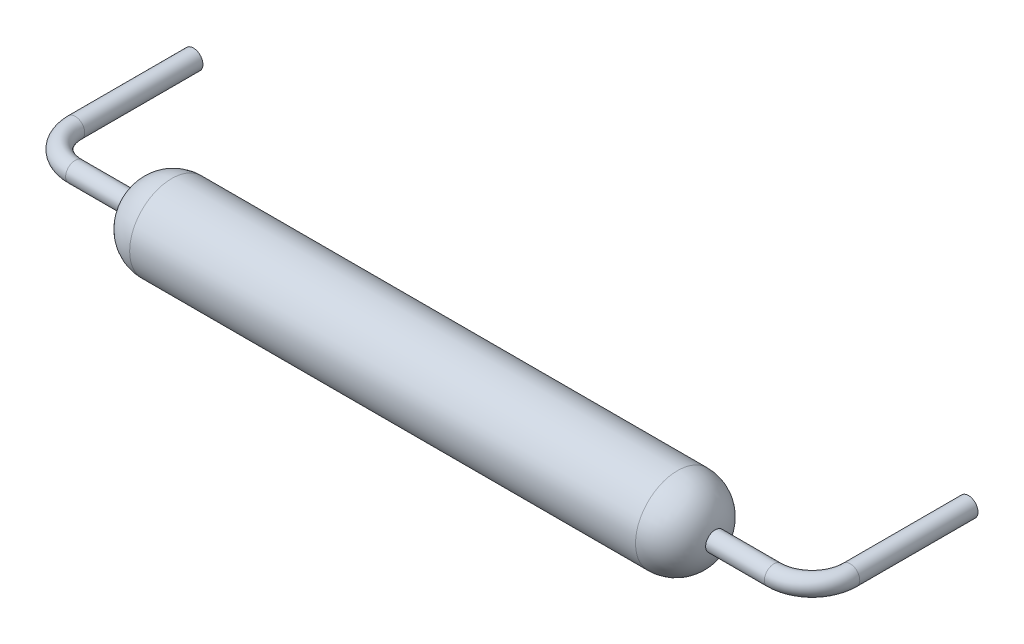
ISO-10303-21;
HEADER;
FILE_DESCRIPTION(('STEP AP214'),'2;1');
FILE_NAME('part.step','',(''),(''),'','','');
FILE_SCHEMA(('AUTOMOTIVE_DESIGN { 1 0 10303 214 1 1 1 1 }'));
ENDSEC;
DATA;
#1=APPLICATION_CONTEXT('core data for automotive mechanical design processes');
#2=APPLICATION_PROTOCOL_DEFINITION('international standard','automotive_design',2000,#1);
#3=PRODUCT_CONTEXT('',#1,'mechanical');
#4=PRODUCT('Part','Part','',(#3));
#5=PRODUCT_RELATED_PRODUCT_CATEGORY('part','',(#4));
#6=PRODUCT_DEFINITION_FORMATION('','',#4);
#7=PRODUCT_DEFINITION_CONTEXT('part definition',#1,'design');
#8=PRODUCT_DEFINITION('design','',#6,#7);
#9=PRODUCT_DEFINITION_SHAPE('','',#8);
#10=(LENGTH_UNIT() NAMED_UNIT(*) SI_UNIT(.MILLI.,.METRE.));
#11=(NAMED_UNIT(*) PLANE_ANGLE_UNIT() SI_UNIT($,.RADIAN.));
#12=(NAMED_UNIT(*) SI_UNIT($,.STERADIAN.) SOLID_ANGLE_UNIT());
#13=UNCERTAINTY_MEASURE_WITH_UNIT(LENGTH_MEASURE(1.E-05),#10,'distance_accuracy_value','');
#14=(GEOMETRIC_REPRESENTATION_CONTEXT(3) GLOBAL_UNCERTAINTY_ASSIGNED_CONTEXT((#13)) GLOBAL_UNIT_ASSIGNED_CONTEXT((#10,
#11,#12)) REPRESENTATION_CONTEXT('',''));
#15=CARTESIAN_POINT('',(0.,0.,0.));
#16=DIRECTION('',(0.,0.,1.));
#17=DIRECTION('',(1.,0.,0.));
#18=AXIS2_PLACEMENT_3D('',#15,#16,#17);
#19=CARTESIAN_POINT('',(10.16,0.,1.1));
#20=DIRECTION('',(-1.,0.,0.));
#21=DIRECTION('',(0.,0.,1.));
#22=AXIS2_PLACEMENT_3D('',#19,#20,#21);
#23=CYLINDRICAL_SURFACE('',#22,1.1);
#24=CARTESIAN_POINT('',(3.52868599666425,0.,1.1));
#25=DIRECTION('',(-1.,0.,0.));
#26=DIRECTION('',(0.,0.,1.));
#27=AXIS2_PLACEMENT_3D('',#24,#25,#26);
#28=CIRCLE('',#27,1.1);
#29=CARTESIAN_POINT('',(3.52868599666425,0.,2.2));
#30=VERTEX_POINT('',#29);
#31=EDGE_CURVE('E10',#30,#30,#28,.F.);
#32=ORIENTED_EDGE('',*,*,#31,.T.);
#33=EDGE_LOOP('',(#32));
#34=FACE_BOUND('',#33,.T.);
#35=CARTESIAN_POINT('',(16.7913140033357,0.,1.1));
#36=DIRECTION('',(-1.,0.,0.));
#37=DIRECTION('',(0.,0.,1.));
#38=AXIS2_PLACEMENT_3D('',#35,#36,#37);
#39=CIRCLE('',#38,1.1);
#40=CARTESIAN_POINT('',(16.7913140033357,0.,2.2));
#41=VERTEX_POINT('',#40);
#42=EDGE_CURVE('E58',#41,#41,#39,.F.);
#43=ORIENTED_EDGE('',*,*,#42,.F.);
#44=EDGE_LOOP('',(#43));
#45=FACE_BOUND('',#44,.T.);
#46=ADVANCED_FACE('F33',(#34,#45),#23,.T.);
#47=CARTESIAN_POINT('',(0.,0.,0.100000000000001));
#48=DIRECTION('',(0.,0.,-1.));
#49=DIRECTION('',(-1.,0.,0.));
#50=AXIS2_PLACEMENT_3D('',#47,#48,#49);
#51=CYLINDRICAL_SURFACE('',#50,0.25);
#52=CARTESIAN_POINT('',(0.,0.,0.100000000000001));
#53=DIRECTION('',(0.,0.,-1.));
#54=DIRECTION('',(-1.,0.,0.));
#55=AXIS2_PLACEMENT_3D('',#52,#53,#54);
#56=CIRCLE('',#55,0.25);
#57=CARTESIAN_POINT('',(-0.250000000000001,0.,0.100000000000001));
#58=VERTEX_POINT('',#57);
#59=EDGE_CURVE('E49',#58,#58,#56,.T.);
#60=ORIENTED_EDGE('',*,*,#59,.T.);
#61=EDGE_LOOP('',(#60));
#62=FACE_BOUND('',#61,.T.);
#63=CARTESIAN_POINT('',(0.,0.,-3.));
#64=DIRECTION('',(0.,0.,-1.));
#65=DIRECTION('',(-1.,0.,0.));
#66=AXIS2_PLACEMENT_3D('',#63,#64,#65);
#67=CIRCLE('',#66,0.25);
#68=CARTESIAN_POINT('',(-0.250000000000001,0.,-3.));
#69=VERTEX_POINT('',#68);
#70=EDGE_CURVE('E44',#69,#69,#67,.T.);
#71=ORIENTED_EDGE('',*,*,#70,.F.);
#72=EDGE_LOOP('',(#71));
#73=FACE_BOUND('',#72,.T.);
#74=ADVANCED_FACE('F105',(#62,#73),#51,.T.);
#75=CARTESIAN_POINT('',(1.,0.,0.1));
#76=DIRECTION('',(0.,-1.,0.));
#77=DIRECTION('',(0.,0.,-1.));
#78=AXIS2_PLACEMENT_3D('',#75,#76,#77);
#79=TOROIDAL_SURFACE('',#78,1.,0.25);
#80=CARTESIAN_POINT('',(1.,0.,1.1));
#81=DIRECTION('',(-1.,0.,0.));
#82=DIRECTION('',(0.,0.,1.));
#83=AXIS2_PLACEMENT_3D('',#80,#81,#82);
#84=CIRCLE('',#83,0.25);
#85=CARTESIAN_POINT('',(1.,0.,1.35));
#86=VERTEX_POINT('',#85);
#87=EDGE_CURVE('E52',#86,#86,#84,.T.);
#88=CARTESIAN_POINT('',(1.,0.,0.1));
#89=DIRECTION('',(0.,-1.,0.));
#90=DIRECTION('',(0.,0.,-1.));
#91=AXIS2_PLACEMENT_3D('',#88,#89,#90);
#92=CIRCLE('',#91,1.25);
#93=EDGE_CURVE('',#86,#58,#92,.T.);
#94=ORIENTED_EDGE('',*,*,#87,.T.);
#95=ORIENTED_EDGE('',*,*,#59,.F.);
#96=ORIENTED_EDGE('',*,*,#93,.T.);
#97=ORIENTED_EDGE('',*,*,#93,.F.);
#98=EDGE_LOOP('',(#94,#96,#95,#97));
#99=FACE_BOUND('',#98,.T.);
#100=ADVANCED_FACE('F109',(#99),#79,.T.);
#101=CARTESIAN_POINT('',(1.,0.,1.1));
#102=DIRECTION('',(1.,0.,0.));
#103=DIRECTION('',(0.,0.,-1.));
#104=AXIS2_PLACEMENT_3D('',#101,#102,#103);
#105=CYLINDRICAL_SURFACE('',#104,0.25);
#106=ORIENTED_EDGE('',*,*,#87,.F.);
#107=EDGE_LOOP('',(#106));
#108=FACE_BOUND('',#107,.T.);
#109=CARTESIAN_POINT('',(2.54,0.,1.1));
#110=DIRECTION('',(-1.,0.,0.));
#111=DIRECTION('',(0.,0.,1.));
#112=AXIS2_PLACEMENT_3D('',#109,#110,#111);
#113=CIRCLE('',#112,0.25);
#114=CARTESIAN_POINT('',(2.54,0.,1.35));
#115=VERTEX_POINT('',#114);
#116=EDGE_CURVE('E40',#115,#115,#113,.T.);
#117=ORIENTED_EDGE('',*,*,#116,.T.);
#118=EDGE_LOOP('',(#117));
#119=FACE_BOUND('',#118,.T.);
#120=ADVANCED_FACE('F115',(#108,#119),#105,.T.);
#121=CARTESIAN_POINT('',(0.,0.,-3.));
#122=DIRECTION('',(0.,0.,-1.));
#123=DIRECTION('',(-1.,0.,0.));
#124=AXIS2_PLACEMENT_3D('',#121,#122,#123);
#125=PLANE('',#124);
#126=ORIENTED_EDGE('',*,*,#70,.T.);
#127=EDGE_LOOP('',(#126));
#128=FACE_BOUND('',#127,.T.);
#129=ADVANCED_FACE('F118',(#128),#125,.T.);
#130=CARTESIAN_POINT('',(3.52868599666426,0.,1.1));
#131=DIRECTION('',(-1.,0.,0.));
#132=DIRECTION('',(0.,0.,1.));
#133=AXIS2_PLACEMENT_3D('',#130,#131,#132);
#134=DEGENERATE_TOROIDAL_SURFACE('',#133,0.1,1.,.T.);
#135=ORIENTED_EDGE('',*,*,#116,.F.);
#136=EDGE_LOOP('',(#135));
#137=FACE_BOUND('',#136,.T.);
#138=ORIENTED_EDGE('',*,*,#31,.F.);
#139=EDGE_LOOP('',(#138));
#140=FACE_BOUND('',#139,.T.);
#141=ADVANCED_FACE('F35',(#137,#140),#134,.T.);
#142=CARTESIAN_POINT('',(20.32,0.,0.100000000000001));
#143=DIRECTION('',(0.,0.,-1.));
#144=DIRECTION('',(1.,0.,0.));
#145=AXIS2_PLACEMENT_3D('',#142,#143,#144);
#146=CYLINDRICAL_SURFACE('',#145,0.25);
#147=CARTESIAN_POINT('',(20.32,0.,0.100000000000001));
#148=DIRECTION('',(0.,0.,1.));
#149=DIRECTION('',(1.,0.,0.));
#150=AXIS2_PLACEMENT_3D('',#147,#148,#149);
#151=CIRCLE('',#150,0.25);
#152=CARTESIAN_POINT('',(20.57,0.,0.100000000000001));
#153=VERTEX_POINT('',#152);
#154=EDGE_CURVE('E71',#153,#153,#151,.T.);
#155=ORIENTED_EDGE('',*,*,#154,.F.);
#156=EDGE_LOOP('',(#155));
#157=FACE_BOUND('',#156,.T.);
#158=CARTESIAN_POINT('',(20.32,0.,-3.));
#159=DIRECTION('',(0.,0.,1.));
#160=DIRECTION('',(1.,0.,0.));
#161=AXIS2_PLACEMENT_3D('',#158,#159,#160);
#162=CIRCLE('',#161,0.25);
#163=CARTESIAN_POINT('',(20.57,0.,-3.));
#164=VERTEX_POINT('',#163);
#165=EDGE_CURVE('E66',#164,#164,#162,.T.);
#166=ORIENTED_EDGE('',*,*,#165,.T.);
#167=EDGE_LOOP('',(#166));
#168=FACE_BOUND('',#167,.T.);
#169=ADVANCED_FACE('F84',(#157,#168),#146,.T.);
#170=CARTESIAN_POINT('',(19.32,0.,0.1));
#171=DIRECTION('',(0.,-1.,0.));
#172=DIRECTION('',(0.,0.,-1.));
#173=AXIS2_PLACEMENT_3D('',#170,#171,#172);
#174=TOROIDAL_SURFACE('',#173,1.,0.25);
#175=CARTESIAN_POINT('',(19.32,0.,1.1));
#176=DIRECTION('',(-1.,0.,0.));
#177=DIRECTION('',(0.,0.,1.));
#178=AXIS2_PLACEMENT_3D('',#175,#176,#177);
#179=CIRCLE('',#178,0.25);
#180=CARTESIAN_POINT('',(19.32,0.,1.35));
#181=VERTEX_POINT('',#180);
#182=EDGE_CURVE('E73',#181,#181,#179,.T.);
#183=CARTESIAN_POINT('',(19.32,0.,0.1));
#184=DIRECTION('',(0.,-1.,0.));
#185=DIRECTION('',(0.,0.,-1.));
#186=AXIS2_PLACEMENT_3D('',#183,#184,#185);
#187=CIRCLE('',#186,1.25);
#188=EDGE_CURVE('',#153,#181,#187,.T.);
#189=ORIENTED_EDGE('',*,*,#154,.T.);
#190=ORIENTED_EDGE('',*,*,#182,.F.);
#191=ORIENTED_EDGE('',*,*,#188,.T.);
#192=ORIENTED_EDGE('',*,*,#188,.F.);
#193=EDGE_LOOP('',(#189,#191,#190,#192));
#194=FACE_BOUND('',#193,.T.);
#195=ADVANCED_FACE('F81',(#194),#174,.T.);
#196=CARTESIAN_POINT('',(19.32,0.,1.1));
#197=DIRECTION('',(-1.,0.,0.));
#198=DIRECTION('',(0.,0.,-1.));
#199=AXIS2_PLACEMENT_3D('',#196,#197,#198);
#200=CYLINDRICAL_SURFACE('',#199,0.25);
#201=ORIENTED_EDGE('',*,*,#182,.T.);
#202=EDGE_LOOP('',(#201));
#203=FACE_BOUND('',#202,.T.);
#204=CARTESIAN_POINT('',(17.78,0.,1.1));
#205=DIRECTION('',(-1.,0.,0.));
#206=DIRECTION('',(0.,0.,1.));
#207=AXIS2_PLACEMENT_3D('',#204,#205,#206);
#208=CIRCLE('',#207,0.25);
#209=CARTESIAN_POINT('',(17.78,0.,1.35));
#210=VERTEX_POINT('',#209);
#211=EDGE_CURVE('E62',#210,#210,#208,.T.);
#212=ORIENTED_EDGE('',*,*,#211,.F.);
#213=EDGE_LOOP('',(#212));
#214=FACE_BOUND('',#213,.T.);
#215=ADVANCED_FACE('F78',(#203,#214),#200,.T.);
#216=CARTESIAN_POINT('',(20.32,0.,-3.));
#217=DIRECTION('',(0.,0.,-1.));
#218=DIRECTION('',(1.,0.,0.));
#219=AXIS2_PLACEMENT_3D('',#216,#217,#218);
#220=PLANE('',#219);
#221=ORIENTED_EDGE('',*,*,#165,.F.);
#222=EDGE_LOOP('',(#221));
#223=FACE_BOUND('',#222,.T.);
#224=ADVANCED_FACE('F93',(#223),#220,.T.);
#225=CARTESIAN_POINT('',(16.7913140033357,0.,1.1));
#226=DIRECTION('',(1.,0.,0.));
#227=DIRECTION('',(0.,0.,1.));
#228=AXIS2_PLACEMENT_3D('',#225,#226,#227);
#229=DEGENERATE_TOROIDAL_SURFACE('',#228,0.1,1.,.T.);
#230=ORIENTED_EDGE('',*,*,#211,.T.);
#231=EDGE_LOOP('',(#230));
#232=FACE_BOUND('',#231,.T.);
#233=ORIENTED_EDGE('',*,*,#42,.T.);
#234=EDGE_LOOP('',(#233));
#235=FACE_BOUND('',#234,.T.);
#236=ADVANCED_FACE('F95',(#232,#235),#229,.T.);
#237=CLOSED_SHELL('',(#46,#74,#100,#120,#129,#141,#169,#195,#215,#224,#236));
#238=MANIFOLD_SOLID_BREP('B2',#237);
#239=ADVANCED_BREP_SHAPE_REPRESENTATION('',(#18,#238),#14);
#240=SHAPE_DEFINITION_REPRESENTATION(#9,#239);
ENDSEC;
END-ISO-10303-21;
